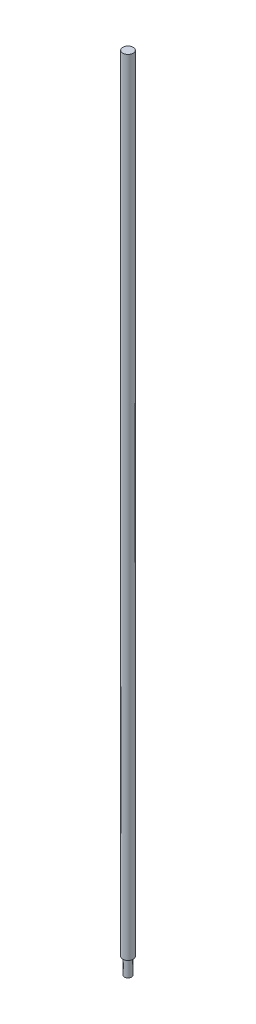
ISO-10303-21;
HEADER;
FILE_DESCRIPTION(('STEP AP214'),'2;1');
FILE_NAME('part.step','',(''),(''),'','','');
FILE_SCHEMA(('AUTOMOTIVE_DESIGN { 1 0 10303 214 1 1 1 1 }'));
ENDSEC;
DATA;
#1=APPLICATION_CONTEXT('core data for automotive mechanical design processes');
#2=APPLICATION_PROTOCOL_DEFINITION('international standard','automotive_design',2000,#1);
#3=PRODUCT_CONTEXT('',#1,'mechanical');
#4=PRODUCT('Part','Part','',(#3));
#5=PRODUCT_RELATED_PRODUCT_CATEGORY('part','',(#4));
#6=PRODUCT_DEFINITION_FORMATION('','',#4);
#7=PRODUCT_DEFINITION_CONTEXT('part definition',#1,'design');
#8=PRODUCT_DEFINITION('design','',#6,#7);
#9=PRODUCT_DEFINITION_SHAPE('','',#8);
#10=(LENGTH_UNIT() NAMED_UNIT(*) SI_UNIT(.MILLI.,.METRE.));
#11=(NAMED_UNIT(*) PLANE_ANGLE_UNIT() SI_UNIT($,.RADIAN.));
#12=(NAMED_UNIT(*) SI_UNIT($,.STERADIAN.) SOLID_ANGLE_UNIT());
#13=UNCERTAINTY_MEASURE_WITH_UNIT(LENGTH_MEASURE(1.E-05),#10,'distance_accuracy_value','');
#14=(GEOMETRIC_REPRESENTATION_CONTEXT(3) GLOBAL_UNCERTAINTY_ASSIGNED_CONTEXT((#13)) GLOBAL_UNIT_ASSIGNED_CONTEXT((#10,
#11,#12)) REPRESENTATION_CONTEXT('',''));
#15=CARTESIAN_POINT('',(0.,0.,0.));
#16=DIRECTION('',(0.,0.,1.));
#17=DIRECTION('',(1.,0.,0.));
#18=AXIS2_PLACEMENT_3D('',#15,#16,#17);
#19=CARTESIAN_POINT('',(0.,0.,0.));
#20=DIRECTION('',(0.,1.,0.));
#21=DIRECTION('',(0.,0.,1.));
#22=AXIS2_PLACEMENT_3D('',#19,#20,#21);
#23=PLANE('',#22);
#24=CARTESIAN_POINT('',(0.,0.,0.));
#25=DIRECTION('',(0.,1.,0.));
#26=DIRECTION('',(0.,0.,1.));
#27=AXIS2_PLACEMENT_3D('',#24,#25,#26);
#28=CIRCLE('',#27,3.);
#29=CARTESIAN_POINT('',(0.,0.,-3.));
#30=VERTEX_POINT('',#29);
#31=EDGE_CURVE('E45',#30,#30,#28,.T.);
#32=ORIENTED_EDGE('',*,*,#31,.F.);
#33=EDGE_LOOP('',(#32));
#34=FACE_BOUND('',#33,.T.);
#35=CARTESIAN_POINT('',(0.,0.,0.));
#36=DIRECTION('',(0.,1.,0.));
#37=DIRECTION('',(0.,0.,1.));
#38=AXIS2_PLACEMENT_3D('',#35,#36,#37);
#39=CIRCLE('',#38,2.);
#40=CARTESIAN_POINT('',(0.,0.,2.));
#41=VERTEX_POINT('',#40);
#42=EDGE_CURVE('E10',#41,#41,#39,.F.);
#43=ORIENTED_EDGE('',*,*,#42,.F.);
#44=EDGE_LOOP('',(#43));
#45=FACE_BOUND('',#44,.T.);
#46=ADVANCED_FACE('F34',(#34,#45),#23,.F.);
#47=CARTESIAN_POINT('',(0.,455.,0.));
#48=DIRECTION('',(0.,-1.,0.));
#49=DIRECTION('',(0.,0.,-1.));
#50=AXIS2_PLACEMENT_3D('',#47,#48,#49);
#51=CYLINDRICAL_SURFACE('',#50,3.);
#52=CARTESIAN_POINT('',(0.,455.,0.));
#53=DIRECTION('',(0.,1.,0.));
#54=DIRECTION('',(0.,0.,1.));
#55=AXIS2_PLACEMENT_3D('',#52,#53,#54);
#56=CIRCLE('',#55,3.);
#57=CARTESIAN_POINT('',(0.,455.,-3.));
#58=VERTEX_POINT('',#57);
#59=EDGE_CURVE('E41',#58,#58,#56,.T.);
#60=CARTESIAN_POINT('',(0.,455.,-3.));
#61=CARTESIAN_POINT('',(0.,450.260416666667,-3.));
#62=CARTESIAN_POINT('',(0.,445.520833333333,-3.));
#63=CARTESIAN_POINT('',(0.,436.041666666667,-3.));
#64=CARTESIAN_POINT('',(0.,431.302083333333,-3.));
#65=CARTESIAN_POINT('',(0.,421.822916666667,-3.));
#66=CARTESIAN_POINT('',(0.,417.083333333333,-3.));
#67=CARTESIAN_POINT('',(0.,407.604166666667,-3.));
#68=CARTESIAN_POINT('',(0.,402.864583333333,-3.));
#69=CARTESIAN_POINT('',(0.,393.385416666667,-3.));
#70=CARTESIAN_POINT('',(0.,388.645833333333,-3.));
#71=CARTESIAN_POINT('',(0.,379.166666666667,-3.));
#72=CARTESIAN_POINT('',(0.,374.427083333333,-3.));
#73=CARTESIAN_POINT('',(0.,364.947916666667,-3.));
#74=CARTESIAN_POINT('',(0.,360.208333333333,-3.));
#75=CARTESIAN_POINT('',(0.,350.729166666667,-3.));
#76=CARTESIAN_POINT('',(0.,345.989583333333,-3.));
#77=CARTESIAN_POINT('',(0.,336.510416666667,-3.));
#78=CARTESIAN_POINT('',(0.,331.770833333333,-3.));
#79=CARTESIAN_POINT('',(0.,322.291666666667,-3.));
#80=CARTESIAN_POINT('',(0.,317.552083333333,-3.));
#81=CARTESIAN_POINT('',(0.,308.072916666667,-3.));
#82=CARTESIAN_POINT('',(0.,303.333333333333,-3.));
#83=CARTESIAN_POINT('',(0.,293.854166666667,-3.));
#84=CARTESIAN_POINT('',(0.,289.114583333333,-3.));
#85=CARTESIAN_POINT('',(0.,279.635416666667,-3.));
#86=CARTESIAN_POINT('',(0.,274.895833333333,-3.));
#87=CARTESIAN_POINT('',(0.,265.416666666667,-3.));
#88=CARTESIAN_POINT('',(0.,260.677083333333,-3.));
#89=CARTESIAN_POINT('',(0.,251.197916666667,-3.));
#90=CARTESIAN_POINT('',(0.,246.458333333333,-3.));
#91=CARTESIAN_POINT('',(0.,236.979166666667,-3.));
#92=CARTESIAN_POINT('',(0.,232.239583333333,-3.));
#93=CARTESIAN_POINT('',(0.,222.760416666667,-3.));
#94=CARTESIAN_POINT('',(0.,218.020833333333,-3.));
#95=CARTESIAN_POINT('',(0.,208.541666666667,-3.));
#96=CARTESIAN_POINT('',(0.,203.802083333333,-3.));
#97=CARTESIAN_POINT('',(0.,194.322916666667,-3.));
#98=CARTESIAN_POINT('',(0.,189.583333333333,-3.));
#99=CARTESIAN_POINT('',(0.,180.104166666667,-3.));
#100=CARTESIAN_POINT('',(0.,175.364583333333,-3.));
#101=CARTESIAN_POINT('',(0.,165.885416666667,-3.));
#102=CARTESIAN_POINT('',(0.,161.145833333333,-3.));
#103=CARTESIAN_POINT('',(0.,151.666666666667,-3.));
#104=CARTESIAN_POINT('',(0.,146.927083333333,-3.));
#105=CARTESIAN_POINT('',(0.,137.447916666667,-3.));
#106=CARTESIAN_POINT('',(0.,132.708333333333,-3.));
#107=CARTESIAN_POINT('',(0.,123.229166666667,-3.));
#108=CARTESIAN_POINT('',(0.,118.489583333333,-3.));
#109=CARTESIAN_POINT('',(0.,109.010416666667,-3.));
#110=CARTESIAN_POINT('',(0.,104.270833333333,-3.));
#111=CARTESIAN_POINT('',(0.,94.7916666666667,-3.));
#112=CARTESIAN_POINT('',(0.,90.0520833333334,-3.));
#113=CARTESIAN_POINT('',(0.,80.5729166666667,-3.));
#114=CARTESIAN_POINT('',(0.,75.8333333333333,-3.));
#115=CARTESIAN_POINT('',(0.,66.3541666666667,-3.));
#116=CARTESIAN_POINT('',(0.,61.6145833333333,-3.));
#117=CARTESIAN_POINT('',(0.,52.1354166666667,-3.));
#118=CARTESIAN_POINT('',(0.,47.3958333333333,-3.));
#119=CARTESIAN_POINT('',(0.,37.9166666666667,-3.));
#120=CARTESIAN_POINT('',(0.,33.1770833333333,-3.));
#121=CARTESIAN_POINT('',(0.,23.6979166666667,-3.));
#122=CARTESIAN_POINT('',(0.,18.9583333333333,-3.));
#123=CARTESIAN_POINT('',(0.,9.47916666666667,-3.));
#124=CARTESIAN_POINT('',(0.,4.73958333333333,-3.));
#125=CARTESIAN_POINT('',(0.,0.,-3.));
#126=B_SPLINE_CURVE_WITH_KNOTS('',3,(#60,#61,#62,#63,#64,#65,#66,#67,#68,#69,#70,#71,#72,#73,
#74,#75,#76,#77,#78,#79,#80,#81,#82,#83,#84,#85,#86,#87,#88,#89,#90,#91,#92,#93,#94,#95,#96,#97,
#98,#99,#100,#101,#102,#103,#104,#105,#106,#107,#108,#109,#110,#111,#112,#113,#114,#115,#116,
#117,#118,#119,#120,#121,#122,#123,#124,#125),.UNSPECIFIED.,.F.,.F.,(4,2,2,2,2,2,2,2,2,2,2,2,2,
2,2,2,2,2,2,2,2,2,2,2,2,2,2,2,2,2,2,2,4),(0.,14.2187499999999,28.4375,42.65625,56.875,71.09375,
85.3125,99.53125,113.75,127.96875,142.1875,156.40625,170.625,184.84375,199.0625,213.28125,227.5,
241.71875,255.9375,270.15625,284.375,298.59375,312.8125,327.03125,341.25,355.46875,369.6875,
383.90625,398.125,412.34375,426.5625,440.78125,455.),.UNSPECIFIED.);
#127=EDGE_CURVE('BSEAM36',#58,#30,#126,.T.);
#128=ORIENTED_EDGE('',*,*,#59,.F.);
#129=ORIENTED_EDGE('',*,*,#31,.T.);
#130=ORIENTED_EDGE('',*,*,#127,.T.);
#131=ORIENTED_EDGE('',*,*,#127,.F.);
#132=EDGE_LOOP('',(#128,#130,#129,#131));
#133=FACE_BOUND('',#132,.T.);
#134=ADVANCED_FACE('F36',(#133),#51,.T.);
#135=CARTESIAN_POINT('',(0.,455.,0.));
#136=DIRECTION('',(0.,1.,0.));
#137=DIRECTION('',(0.,0.,1.));
#138=AXIS2_PLACEMENT_3D('',#135,#136,#137);
#139=PLANE('',#138);
#140=ORIENTED_EDGE('',*,*,#59,.T.);
#141=EDGE_LOOP('',(#140));
#142=FACE_BOUND('',#141,.T.);
#143=ADVANCED_FACE('F59',(#142),#139,.T.);
#144=CARTESIAN_POINT('',(0.,-9.5,0.));
#145=DIRECTION('',(0.,1.,0.));
#146=DIRECTION('',(0.,0.,1.));
#147=AXIS2_PLACEMENT_3D('',#144,#145,#146);
#148=CYLINDRICAL_SURFACE('',#147,2.);
#149=CARTESIAN_POINT('',(0.,-9.5,0.));
#150=DIRECTION('',(0.,-1.,0.));
#151=DIRECTION('',(0.,0.,-1.));
#152=AXIS2_PLACEMENT_3D('',#149,#150,#151);
#153=CIRCLE('',#152,2.);
#154=CARTESIAN_POINT('',(0.,-9.5,-2.));
#155=VERTEX_POINT('',#154);
#156=EDGE_CURVE('E50',#155,#155,#153,.T.);
#157=ORIENTED_EDGE('',*,*,#156,.F.);
#158=EDGE_LOOP('',(#157));
#159=FACE_BOUND('',#158,.T.);
#160=ORIENTED_EDGE('',*,*,#42,.T.);
#161=EDGE_LOOP('',(#160));
#162=FACE_BOUND('',#161,.T.);
#163=ADVANCED_FACE('F57',(#159,#162),#148,.T.);
#164=CARTESIAN_POINT('',(0.,-9.5,0.));
#165=DIRECTION('',(0.,-1.,0.));
#166=DIRECTION('',(0.,0.,-1.));
#167=AXIS2_PLACEMENT_3D('',#164,#165,#166);
#168=PLANE('',#167);
#169=ORIENTED_EDGE('',*,*,#156,.T.);
#170=EDGE_LOOP('',(#169));
#171=FACE_BOUND('',#170,.T.);
#172=ADVANCED_FACE('F55',(#171),#168,.T.);
#173=CLOSED_SHELL('',(#46,#134,#143,#163,#172));
#174=MANIFOLD_SOLID_BREP('B2',#173);
#175=ADVANCED_BREP_SHAPE_REPRESENTATION('',(#18,#174),#14);
#176=SHAPE_DEFINITION_REPRESENTATION(#9,#175);
ENDSEC;
END-ISO-10303-21;
